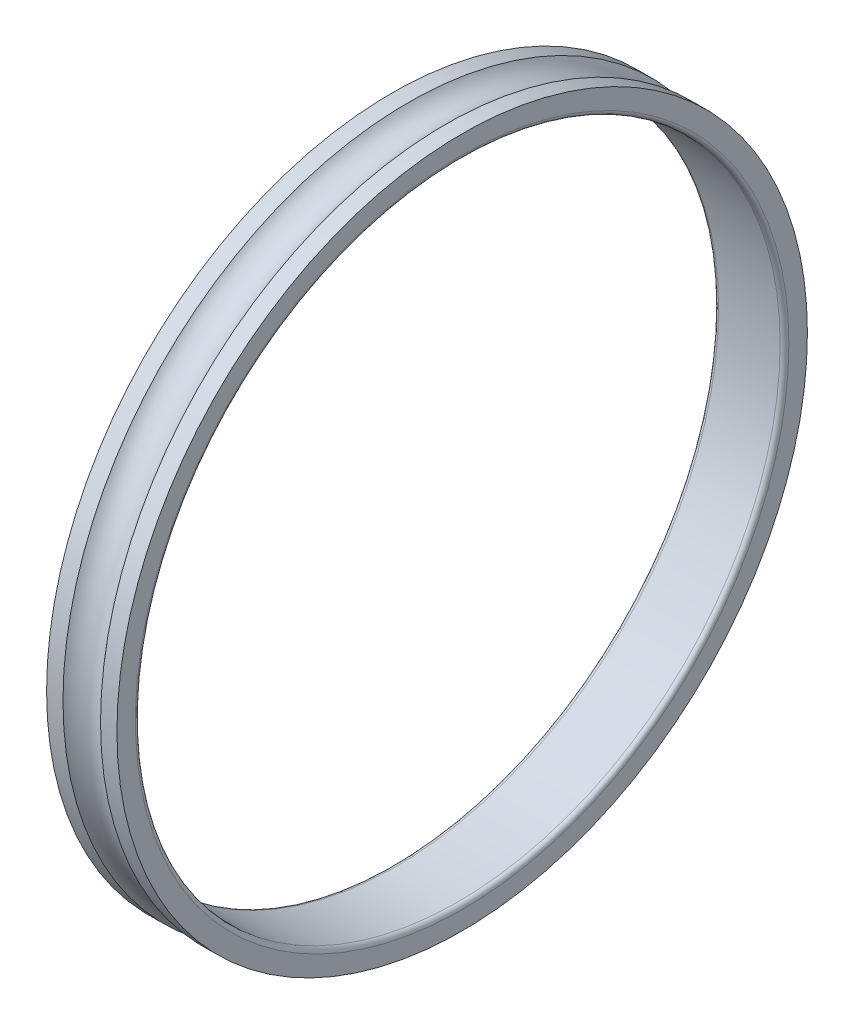
ISO-10303-21;
HEADER;
FILE_DESCRIPTION(('STEP AP214'),'2;1');
FILE_NAME('part.step','',(''),(''),'','','');
FILE_SCHEMA(('AUTOMOTIVE_DESIGN { 1 0 10303 214 1 1 1 1 }'));
ENDSEC;
DATA;
#1=APPLICATION_CONTEXT('core data for automotive mechanical design processes');
#2=APPLICATION_PROTOCOL_DEFINITION('international standard','automotive_design',2000,#1);
#3=PRODUCT_CONTEXT('',#1,'mechanical');
#4=PRODUCT('Part','Part','',(#3));
#5=PRODUCT_RELATED_PRODUCT_CATEGORY('part','',(#4));
#6=PRODUCT_DEFINITION_FORMATION('','',#4);
#7=PRODUCT_DEFINITION_CONTEXT('part definition',#1,'design');
#8=PRODUCT_DEFINITION('design','',#6,#7);
#9=PRODUCT_DEFINITION_SHAPE('','',#8);
#10=(LENGTH_UNIT() NAMED_UNIT(*) SI_UNIT(.MILLI.,.METRE.));
#11=(NAMED_UNIT(*) PLANE_ANGLE_UNIT() SI_UNIT($,.RADIAN.));
#12=(NAMED_UNIT(*) SI_UNIT($,.STERADIAN.) SOLID_ANGLE_UNIT());
#13=UNCERTAINTY_MEASURE_WITH_UNIT(LENGTH_MEASURE(1.E-05),#10,'distance_accuracy_value','');
#14=(GEOMETRIC_REPRESENTATION_CONTEXT(3) GLOBAL_UNCERTAINTY_ASSIGNED_CONTEXT((#13)) GLOBAL_UNIT_ASSIGNED_CONTEXT((#10,
#11,#12)) REPRESENTATION_CONTEXT('',''));
#15=CARTESIAN_POINT('',(0.,0.,0.));
#16=DIRECTION('',(0.,0.,1.));
#17=DIRECTION('',(1.,0.,0.));
#18=AXIS2_PLACEMENT_3D('',#15,#16,#17);
#19=CARTESIAN_POINT('',(13.499,0.,0.));
#20=DIRECTION('',(1.,0.,0.));
#21=DIRECTION('',(0.,-0.866025403784439,-0.5));
#22=AXIS2_PLACEMENT_3D('',#19,#20,#21);
#23=CYLINDRICAL_SURFACE('',#22,117.8125);
#24=CARTESIAN_POINT('',(-4.90534422872464,0.,0.));
#25=DIRECTION('',(1.,0.,0.));
#26=DIRECTION('',(0.,-0.866025403784439,-0.5));
#27=AXIS2_PLACEMENT_3D('',#24,#25,#26);
#28=CIRCLE('',#27,117.8125);
#29=CARTESIAN_POINT('',(-4.90534422872465,102.028617883354,58.90625));
#30=VERTEX_POINT('',#29);
#31=EDGE_CURVE('E27',#30,#30,#28,.T.);
#32=ORIENTED_EDGE('',*,*,#31,.F.);
#33=DIRECTION('',(-1.,0.,0.));
#34=VECTOR('',#33,1.);
#35=CARTESIAN_POINT('',(13.499,102.028617883354,58.90625));
#36=LINE('',#35,#34);
#37=CARTESIAN_POINT('',(-10.501,102.028617883354,58.90625));
#38=VERTEX_POINT('',#37);
#39=EDGE_CURVE('E11',#30,#38,#36,.T.);
#40=ORIENTED_EDGE('',*,*,#39,.T.);
#41=CARTESIAN_POINT('',(-10.501,0.,0.));
#42=DIRECTION('',(1.,0.,0.));
#43=DIRECTION('',(0.,-0.866025403784439,-0.5));
#44=AXIS2_PLACEMENT_3D('',#41,#42,#43);
#45=CIRCLE('',#44,117.8125);
#46=EDGE_CURVE('E73',#38,#38,#45,.T.);
#47=ORIENTED_EDGE('',*,*,#46,.T.);
#48=ORIENTED_EDGE('',*,*,#39,.F.);
#49=EDGE_LOOP('',(#32,#40,#47,#48));
#50=FACE_BOUND('',#49,.T.);
#51=ADVANCED_FACE('F17',(#50),#23,.T.);
#52=CARTESIAN_POINT('',(1.49900000000009,0.,0.));
#53=DIRECTION('',(1.,0.,0.));
#54=DIRECTION('',(0.,-0.866025403784439,-0.5));
#55=AXIS2_PLACEMENT_3D('',#52,#53,#54);
#56=TOROIDAL_SURFACE('',#55,122.8125,8.125);
#57=CARTESIAN_POINT('',(7.9033442287249,0.,0.));
#58=DIRECTION('',(1.,0.,0.));
#59=DIRECTION('',(0.,-0.866025403784439,-0.5));
#60=AXIS2_PLACEMENT_3D('',#57,#58,#59);
#61=CIRCLE('',#60,117.8125);
#62=CARTESIAN_POINT('',(7.90334422872489,102.028617883354,58.90625));
#63=VERTEX_POINT('',#62);
#64=EDGE_CURVE('E21',#63,#63,#61,.T.);
#65=ORIENTED_EDGE('',*,*,#64,.F.);
#66=CARTESIAN_POINT('',(1.49900000000009,106.358744902276,61.40625));
#67=DIRECTION('',(0.,0.5,-0.866025403784439));
#68=DIRECTION('',(0.,0.866025403784439,0.5));
#69=AXIS2_PLACEMENT_3D('',#66,#67,#68);
#70=CIRCLE('',#69,8.125);
#71=EDGE_CURVE('E47',#63,#30,#70,.T.);
#72=ORIENTED_EDGE('',*,*,#71,.T.);
#73=ORIENTED_EDGE('',*,*,#31,.T.);
#74=ORIENTED_EDGE('',*,*,#71,.F.);
#75=EDGE_LOOP('',(#65,#72,#73,#74));
#76=FACE_BOUND('',#75,.T.);
#77=ADVANCED_FACE('F76',(#76),#56,.F.);
#78=CARTESIAN_POINT('',(13.499,0.,0.));
#79=DIRECTION('',(1.,0.,0.));
#80=DIRECTION('',(0.,-0.866025403784439,-0.5));
#81=AXIS2_PLACEMENT_3D('',#78,#79,#80);
#82=CYLINDRICAL_SURFACE('',#81,117.8125);
#83=CARTESIAN_POINT('',(13.499,0.,0.));
#84=DIRECTION('',(1.,0.,0.));
#85=DIRECTION('',(0.,-0.866025403784439,-0.5));
#86=AXIS2_PLACEMENT_3D('',#83,#84,#85);
#87=CIRCLE('',#86,117.8125);
#88=CARTESIAN_POINT('',(13.499,102.028617883354,58.90625));
#89=VERTEX_POINT('',#88);
#90=EDGE_CURVE('E89',#89,#89,#87,.T.);
#91=ORIENTED_EDGE('',*,*,#90,.F.);
#92=DIRECTION('',(-1.,0.,0.));
#93=VECTOR('',#92,1.);
#94=CARTESIAN_POINT('',(13.499,102.028617883354,58.90625));
#95=LINE('',#94,#93);
#96=EDGE_CURVE('E84',#89,#63,#95,.T.);
#97=ORIENTED_EDGE('',*,*,#96,.T.);
#98=ORIENTED_EDGE('',*,*,#64,.T.);
#99=ORIENTED_EDGE('',*,*,#96,.F.);
#100=EDGE_LOOP('',(#91,#97,#98,#99));
#101=FACE_BOUND('',#100,.T.);
#102=ADVANCED_FACE('F19',(#101),#82,.T.);
#103=CARTESIAN_POINT('',(13.499,55.75,-96.561832521965));
#104=DIRECTION('',(1.,0.,0.));
#105=DIRECTION('',(0.,1.,0.));
#106=AXIS2_PLACEMENT_3D('',#103,#104,#105);
#107=PLANE('',#106);
#108=CARTESIAN_POINT('',(13.499,0.,0.));
#109=DIRECTION('',(1.,0.,0.));
#110=DIRECTION('',(0.,-0.866025403784439,-0.5));
#111=AXIS2_PLACEMENT_3D('',#108,#109,#110);
#112=CIRCLE('',#111,111.5);
#113=CARTESIAN_POINT('',(13.499,96.5618325219649,55.75));
#114=VERTEX_POINT('',#113);
#115=EDGE_CURVE('E87',#114,#114,#112,.T.);
#116=ORIENTED_EDGE('',*,*,#115,.F.);
#117=EDGE_LOOP('',(#116));
#118=FACE_BOUND('',#117,.T.);
#119=ORIENTED_EDGE('',*,*,#90,.T.);
#120=EDGE_LOOP('',(#119));
#121=FACE_BOUND('',#120,.T.);
#122=ADVANCED_FACE('F96',(#118,#121),#107,.T.);
#123=CARTESIAN_POINT('',(11.999,0.,0.));
#124=DIRECTION('',(1.,0.,0.));
#125=DIRECTION('',(0.,-0.866025403784439,-0.5));
#126=AXIS2_PLACEMENT_3D('',#123,#124,#125);
#127=TOROIDAL_SURFACE('',#126,111.5,1.5);
#128=CARTESIAN_POINT('',(11.999,0.,0.));
#129=DIRECTION('',(1.,0.,0.));
#130=DIRECTION('',(0.,-0.866025403784439,-0.5));
#131=AXIS2_PLACEMENT_3D('',#128,#129,#130);
#132=CIRCLE('',#131,110.);
#133=CARTESIAN_POINT('',(11.999,95.2627944162882,55.));
#134=VERTEX_POINT('',#133);
#135=EDGE_CURVE('E147',#134,#134,#132,.T.);
#136=ORIENTED_EDGE('',*,*,#135,.F.);
#137=CARTESIAN_POINT('',(11.999,96.5618325219649,55.75));
#138=DIRECTION('',(0.,-0.5,0.866025403784439));
#139=DIRECTION('',(0.,0.866025403784439,0.5));
#140=AXIS2_PLACEMENT_3D('',#137,#138,#139);
#141=CIRCLE('',#140,1.5);
#142=EDGE_CURVE('E153',#134,#114,#141,.T.);
#143=ORIENTED_EDGE('',*,*,#142,.T.);
#144=ORIENTED_EDGE('',*,*,#115,.T.);
#145=ORIENTED_EDGE('',*,*,#142,.F.);
#146=EDGE_LOOP('',(#136,#143,#144,#145));
#147=FACE_BOUND('',#146,.T.);
#148=ADVANCED_FACE('F98',(#147),#127,.T.);
#149=CARTESIAN_POINT('',(13.499,0.,0.));
#150=DIRECTION('',(1.,0.,0.));
#151=DIRECTION('',(0.,-0.866025403784439,-0.5));
#152=AXIS2_PLACEMENT_3D('',#149,#150,#151);
#153=CYLINDRICAL_SURFACE('',#152,110.);
#154=CARTESIAN_POINT('',(-9.00099999999988,0.,0.));
#155=DIRECTION('',(1.,0.,0.));
#156=DIRECTION('',(0.,-0.866025403784439,-0.5));
#157=AXIS2_PLACEMENT_3D('',#154,#155,#156);
#158=CIRCLE('',#157,110.);
#159=CARTESIAN_POINT('',(-9.00099999999989,95.2627944162882,55.));
#160=VERTEX_POINT('',#159);
#161=EDGE_CURVE('E142',#160,#160,#158,.T.);
#162=ORIENTED_EDGE('',*,*,#161,.F.);
#163=DIRECTION('',(1.,0.,0.));
#164=VECTOR('',#163,1.);
#165=CARTESIAN_POINT('',(13.499,95.2627944162882,55.));
#166=LINE('',#165,#164);
#167=EDGE_CURVE('E143',#160,#134,#166,.T.);
#168=ORIENTED_EDGE('',*,*,#167,.T.);
#169=ORIENTED_EDGE('',*,*,#135,.T.);
#170=ORIENTED_EDGE('',*,*,#167,.F.);
#171=EDGE_LOOP('',(#162,#168,#169,#170));
#172=FACE_BOUND('',#171,.T.);
#173=ADVANCED_FACE('F106',(#172),#153,.F.);
#174=CARTESIAN_POINT('',(-9.00099999999988,0.,0.));
#175=DIRECTION('',(1.,0.,0.));
#176=DIRECTION('',(0.,-0.866025403784439,-0.5));
#177=AXIS2_PLACEMENT_3D('',#174,#175,#176);
#178=TOROIDAL_SURFACE('',#177,111.5,1.5);
#179=CARTESIAN_POINT('',(-10.501,0.,0.));
#180=DIRECTION('',(1.,0.,0.));
#181=DIRECTION('',(0.,-0.866025403784439,-0.5));
#182=AXIS2_PLACEMENT_3D('',#179,#180,#181);
#183=CIRCLE('',#182,111.5);
#184=CARTESIAN_POINT('',(-10.501,96.5618325219649,55.75));
#185=VERTEX_POINT('',#184);
#186=EDGE_CURVE('E131',#185,#185,#183,.T.);
#187=ORIENTED_EDGE('',*,*,#186,.F.);
#188=CARTESIAN_POINT('',(-9.00099999999988,96.5618325219649,55.75));
#189=DIRECTION('',(0.,-0.5,0.866025403784439));
#190=DIRECTION('',(0.,0.866025403784439,0.5));
#191=AXIS2_PLACEMENT_3D('',#188,#189,#190);
#192=CIRCLE('',#191,1.5);
#193=EDGE_CURVE('E136',#185,#160,#192,.T.);
#194=ORIENTED_EDGE('',*,*,#193,.T.);
#195=ORIENTED_EDGE('',*,*,#161,.T.);
#196=ORIENTED_EDGE('',*,*,#193,.F.);
#197=EDGE_LOOP('',(#187,#194,#195,#196));
#198=FACE_BOUND('',#197,.T.);
#199=ADVANCED_FACE('F116',(#198),#178,.T.);
#200=CARTESIAN_POINT('',(-10.501,58.90625,-102.028617883354));
#201=DIRECTION('',(-1.,0.,0.));
#202=DIRECTION('',(0.,1.,0.));
#203=AXIS2_PLACEMENT_3D('',#200,#201,#202);
#204=PLANE('',#203);
#205=ORIENTED_EDGE('',*,*,#186,.T.);
#206=EDGE_LOOP('',(#205));
#207=FACE_BOUND('',#206,.T.);
#208=ORIENTED_EDGE('',*,*,#46,.F.);
#209=EDGE_LOOP('',(#208));
#210=FACE_BOUND('',#209,.T.);
#211=ADVANCED_FACE('F119',(#207,#210),#204,.T.);
#212=CLOSED_SHELL('',(#51,#77,#102,#122,#148,#173,#199,#211));
#213=MANIFOLD_SOLID_BREP('B1',#212);
#214=ADVANCED_BREP_SHAPE_REPRESENTATION('',(#18,#213),#14);
#215=SHAPE_DEFINITION_REPRESENTATION(#9,#214);
ENDSEC;
END-ISO-10303-21;
